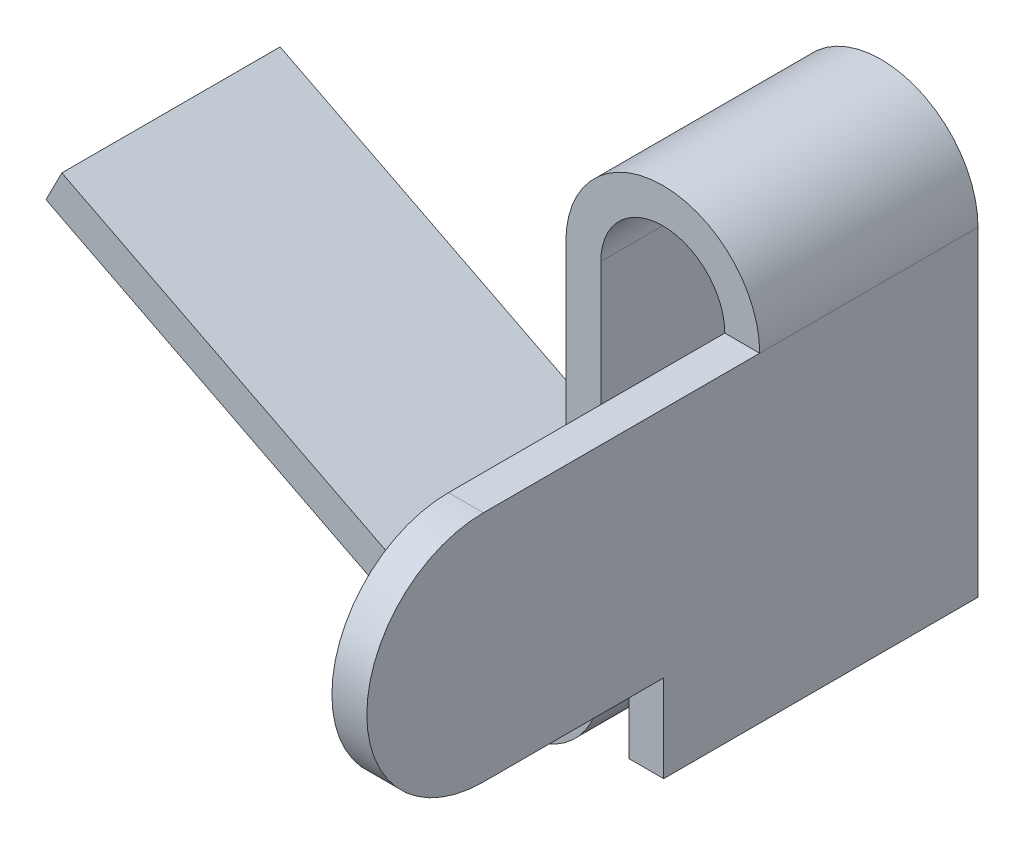
ISO-10303-21;
HEADER;
FILE_DESCRIPTION(('STEP AP214'),'2;1');
FILE_NAME('part.step','',(''),(''),'','','');
FILE_SCHEMA(('AUTOMOTIVE_DESIGN { 1 0 10303 214 1 1 1 1 }'));
ENDSEC;
DATA;
#1=APPLICATION_CONTEXT('core data for automotive mechanical design processes');
#2=APPLICATION_PROTOCOL_DEFINITION('international standard','automotive_design',2000,#1);
#3=PRODUCT_CONTEXT('',#1,'mechanical');
#4=PRODUCT('Part','Part','',(#3));
#5=PRODUCT_RELATED_PRODUCT_CATEGORY('part','',(#4));
#6=PRODUCT_DEFINITION_FORMATION('','',#4);
#7=PRODUCT_DEFINITION_CONTEXT('part definition',#1,'design');
#8=PRODUCT_DEFINITION('design','',#6,#7);
#9=PRODUCT_DEFINITION_SHAPE('','',#8);
#10=(LENGTH_UNIT() NAMED_UNIT(*) SI_UNIT(.MILLI.,.METRE.));
#11=(NAMED_UNIT(*) PLANE_ANGLE_UNIT() SI_UNIT($,.RADIAN.));
#12=(NAMED_UNIT(*) SI_UNIT($,.STERADIAN.) SOLID_ANGLE_UNIT());
#13=UNCERTAINTY_MEASURE_WITH_UNIT(LENGTH_MEASURE(1.E-05),#10,'distance_accuracy_value','');
#14=(GEOMETRIC_REPRESENTATION_CONTEXT(3) GLOBAL_UNCERTAINTY_ASSIGNED_CONTEXT((#13)) GLOBAL_UNIT_ASSIGNED_CONTEXT((#10,
#11,#12)) REPRESENTATION_CONTEXT('',''));
#15=CARTESIAN_POINT('',(0.,0.,0.));
#16=DIRECTION('',(0.,0.,1.));
#17=DIRECTION('',(1.,0.,0.));
#18=AXIS2_PLACEMENT_3D('',#15,#16,#17);
#19=CARTESIAN_POINT('',(0.71,2.335,5.665));
#20=DIRECTION('',(-1.,0.,0.));
#21=DIRECTION('',(0.,0.,1.));
#22=AXIS2_PLACEMENT_3D('',#19,#20,#21);
#23=CYLINDRICAL_SURFACE('',#22,1.335);
#24=DIRECTION('',(-1.,0.,0.));
#25=VECTOR('',#24,1.);
#26=CARTESIAN_POINT('',(0.71,3.67,5.665));
#27=LINE('',#26,#25);
#28=CARTESIAN_POINT('',(0.71,3.67,5.665));
#29=VERTEX_POINT('',#28);
#30=CARTESIAN_POINT('',(1.11,3.67,5.665));
#31=VERTEX_POINT('',#30);
#32=EDGE_CURVE('E262',#29,#31,#27,.F.);
#33=ORIENTED_EDGE('',*,*,#32,.F.);
#34=CARTESIAN_POINT('',(0.71,2.335,5.665));
#35=DIRECTION('',(-1.,0.,0.));
#36=DIRECTION('',(0.,-1.,0.));
#37=AXIS2_PLACEMENT_3D('',#34,#35,#36);
#38=CIRCLE('',#37,1.335);
#39=CARTESIAN_POINT('',(0.71,1.,5.665));
#40=VERTEX_POINT('',#39);
#41=EDGE_CURVE('E44',#40,#29,#38,.T.);
#42=ORIENTED_EDGE('',*,*,#41,.F.);
#43=DIRECTION('',(-1.,0.,0.));
#44=VECTOR('',#43,1.);
#45=CARTESIAN_POINT('',(-7.06552638277556,0.999999999999999,5.665));
#46=LINE('',#45,#44);
#47=CARTESIAN_POINT('',(1.11,1.,5.665));
#48=VERTEX_POINT('',#47);
#49=EDGE_CURVE('E146',#48,#40,#46,.T.);
#50=ORIENTED_EDGE('',*,*,#49,.F.);
#51=CARTESIAN_POINT('',(1.11,2.335,5.665));
#52=DIRECTION('',(-1.,0.,0.));
#53=DIRECTION('',(0.,-1.,0.));
#54=AXIS2_PLACEMENT_3D('',#51,#52,#53);
#55=CIRCLE('',#54,1.335);
#56=EDGE_CURVE('E11',#31,#48,#55,.F.);
#57=ORIENTED_EDGE('',*,*,#56,.F.);
#58=EDGE_LOOP('',(#33,#42,#50,#57));
#59=FACE_BOUND('',#58,.T.);
#60=ADVANCED_FACE('F36',(#59),#23,.T.);
#61=CARTESIAN_POINT('',(0.71,3.67,0.));
#62=DIRECTION('',(0.,0.,-1.));
#63=DIRECTION('',(0.,-1.,0.));
#64=AXIS2_PLACEMENT_3D('',#61,#62,#63);
#65=PLANE('',#64);
#66=DIRECTION('',(0.,-1.,0.));
#67=VECTOR('',#66,1.);
#68=CARTESIAN_POINT('',(0.71,3.67,0.));
#69=LINE('',#68,#67);
#70=CARTESIAN_POINT('',(0.71,3.67,0.));
#71=VERTEX_POINT('',#70);
#72=CARTESIAN_POINT('',(0.71,0.,0.));
#73=VERTEX_POINT('',#72);
#74=EDGE_CURVE('E181',#71,#73,#69,.T.);
#75=ORIENTED_EDGE('',*,*,#74,.F.);
#76=CARTESIAN_POINT('',(0.,3.67,0.));
#77=DIRECTION('',(0.,0.,-1.));
#78=DIRECTION('',(-1.,0.,0.));
#79=AXIS2_PLACEMENT_3D('',#76,#77,#78);
#80=CIRCLE('',#79,0.71);
#81=CARTESIAN_POINT('',(-0.71,3.67,0.));
#82=VERTEX_POINT('',#81);
#83=EDGE_CURVE('E177',#82,#71,#80,.T.);
#84=ORIENTED_EDGE('',*,*,#83,.F.);
#85=DIRECTION('',(0.,1.,0.));
#86=VECTOR('',#85,1.);
#87=CARTESIAN_POINT('',(-0.71,0.,0.));
#88=LINE('',#87,#86);
#89=CARTESIAN_POINT('',(-0.71,-0.5,0.));
#90=VERTEX_POINT('',#89);
#91=EDGE_CURVE('E184',#90,#82,#88,.T.);
#92=ORIENTED_EDGE('',*,*,#91,.F.);
#93=CARTESIAN_POINT('',(-1.71,-0.5,0.));
#94=DIRECTION('',(0.,0.,1.));
#95=DIRECTION('',(-1.,0.,0.));
#96=AXIS2_PLACEMENT_3D('',#93,#94,#95);
#97=CIRCLE('',#96,1.);
#98=CARTESIAN_POINT('',(-2.16399049973955,-1.39100652418837,0.));
#99=VERTEX_POINT('',#98);
#100=EDGE_CURVE('E188',#99,#90,#97,.T.);
#101=ORIENTED_EDGE('',*,*,#100,.F.);
#102=DIRECTION('',(0.891006524188366,-0.453990499739551,0.));
#103=VECTOR('',#102,1.);
#104=CARTESIAN_POINT('',(-2.16399049973955,-1.39100652418837,0.));
#105=LINE('',#104,#103);
#106=CARTESIAN_POINT('',(-7.06452638277556,1.10594122437916,0.));
#107=VERTEX_POINT('',#106);
#108=EDGE_CURVE('E192',#107,#99,#105,.T.);
#109=ORIENTED_EDGE('',*,*,#108,.F.);
#110=DIRECTION('',(-0.453990499739551,-0.891006524188366,0.));
#111=VECTOR('',#110,1.);
#112=CARTESIAN_POINT('',(-7.06452638277556,1.10594122437916,0.));
#113=LINE('',#112,#111);
#114=CARTESIAN_POINT('',(-6.88293018287974,1.46234383405451,0.));
#115=VERTEX_POINT('',#114);
#116=EDGE_CURVE('E260',#115,#107,#113,.T.);
#117=ORIENTED_EDGE('',*,*,#116,.F.);
#118=DIRECTION('',(0.891006524188366,-0.453990499739551,0.));
#119=VECTOR('',#118,1.);
#120=CARTESIAN_POINT('',(-1.98239429984373,-1.03460391451302,0.));
#121=LINE('',#120,#119);
#122=CARTESIAN_POINT('',(-1.98239429984373,-1.03460391451302,0.));
#123=VERTEX_POINT('',#122);
#124=EDGE_CURVE('E209',#115,#123,#121,.T.);
#125=ORIENTED_EDGE('',*,*,#124,.T.);
#126=CARTESIAN_POINT('',(-1.71,-0.5,0.));
#127=DIRECTION('',(0.,0.,1.));
#128=DIRECTION('',(1.,0.,0.));
#129=AXIS2_PLACEMENT_3D('',#126,#127,#128);
#130=CIRCLE('',#129,0.600000000000001);
#131=CARTESIAN_POINT('',(-1.11,-0.5,0.));
#132=VERTEX_POINT('',#131);
#133=EDGE_CURVE('E220',#123,#132,#130,.T.);
#134=ORIENTED_EDGE('',*,*,#133,.T.);
#135=DIRECTION('',(0.,1.,0.));
#136=VECTOR('',#135,1.);
#137=CARTESIAN_POINT('',(-1.11,0.,0.));
#138=LINE('',#137,#136);
#139=CARTESIAN_POINT('',(-1.11,3.67,0.));
#140=VERTEX_POINT('',#139);
#141=EDGE_CURVE('E224',#132,#140,#138,.T.);
#142=ORIENTED_EDGE('',*,*,#141,.T.);
#143=CARTESIAN_POINT('',(0.,3.67,0.));
#144=DIRECTION('',(0.,0.,1.));
#145=DIRECTION('',(1.,0.,0.));
#146=AXIS2_PLACEMENT_3D('',#143,#144,#145);
#147=CIRCLE('',#146,1.11);
#148=CARTESIAN_POINT('',(1.11,3.67,0.));
#149=VERTEX_POINT('',#148);
#150=EDGE_CURVE('E228',#140,#149,#147,.F.);
#151=ORIENTED_EDGE('',*,*,#150,.T.);
#152=DIRECTION('',(0.,-1.,0.));
#153=VECTOR('',#152,1.);
#154=CARTESIAN_POINT('',(1.11,3.67,0.));
#155=LINE('',#154,#153);
#156=CARTESIAN_POINT('',(1.11,0.,0.));
#157=VERTEX_POINT('',#156);
#158=EDGE_CURVE('E232',#149,#157,#155,.T.);
#159=ORIENTED_EDGE('',*,*,#158,.T.);
#160=DIRECTION('',(-1.,0.,0.));
#161=VECTOR('',#160,1.);
#162=CARTESIAN_POINT('',(0.71,0.,0.));
#163=LINE('',#162,#161);
#164=EDGE_CURVE('E258',#157,#73,#163,.T.);
#165=ORIENTED_EDGE('',*,*,#164,.T.);
#166=EDGE_LOOP('',(#75,#84,#92,#101,#109,#117,#125,#134,#142,#151,#159,#165));
#167=FACE_BOUND('',#166,.T.);
#168=ADVANCED_FACE('F315',(#167),#65,.T.);
#169=CARTESIAN_POINT('',(0.71,0.,0.));
#170=DIRECTION('',(0.,-1.,0.));
#171=DIRECTION('',(0.,0.,1.));
#172=AXIS2_PLACEMENT_3D('',#169,#170,#171);
#173=PLANE('',#172);
#174=DIRECTION('',(1.,0.,0.));
#175=VECTOR('',#174,1.);
#176=CARTESIAN_POINT('',(-7.06552638277556,0.,3.6));
#177=LINE('',#176,#175);
#178=CARTESIAN_POINT('',(0.710000000000001,0.,3.6));
#179=VERTEX_POINT('',#178);
#180=CARTESIAN_POINT('',(1.11,0.,3.6));
#181=VERTEX_POINT('',#180);
#182=EDGE_CURVE('E157',#179,#181,#177,.T.);
#183=ORIENTED_EDGE('',*,*,#182,.F.);
#184=DIRECTION('',(0.,0.,1.));
#185=VECTOR('',#184,1.);
#186=CARTESIAN_POINT('',(0.71,0.,0.));
#187=LINE('',#186,#185);
#188=EDGE_CURVE('E163',#73,#179,#187,.T.);
#189=ORIENTED_EDGE('',*,*,#188,.F.);
#190=ORIENTED_EDGE('',*,*,#164,.F.);
#191=DIRECTION('',(0.,0.,1.));
#192=VECTOR('',#191,1.);
#193=CARTESIAN_POINT('',(1.11,0.,0.));
#194=LINE('',#193,#192);
#195=EDGE_CURVE('E243',#157,#181,#194,.T.);
#196=ORIENTED_EDGE('',*,*,#195,.T.);
#197=EDGE_LOOP('',(#183,#189,#190,#196));
#198=FACE_BOUND('',#197,.T.);
#199=ADVANCED_FACE('F314',(#198),#173,.T.);
#200=CARTESIAN_POINT('',(-2.16399049973955,-1.39100652418837,2.5));
#201=DIRECTION('',(0.,0.,-1.));
#202=DIRECTION('',(0.891006524188366,-0.453990499739551,0.));
#203=AXIS2_PLACEMENT_3D('',#200,#201,#202);
#204=PLANE('',#203);
#205=DIRECTION('',(-1.,0.,0.));
#206=VECTOR('',#205,1.);
#207=CARTESIAN_POINT('',(0.71,3.67,2.5));
#208=LINE('',#207,#206);
#209=CARTESIAN_POINT('',(1.11,3.67,2.5));
#210=VERTEX_POINT('',#209);
#211=CARTESIAN_POINT('',(0.71,3.67,2.5));
#212=VERTEX_POINT('',#211);
#213=EDGE_CURVE('E156',#210,#212,#208,.T.);
#214=ORIENTED_EDGE('',*,*,#213,.F.);
#215=CARTESIAN_POINT('',(0.,3.67,2.5));
#216=DIRECTION('',(0.,0.,1.));
#217=DIRECTION('',(1.,0.,0.));
#218=AXIS2_PLACEMENT_3D('',#215,#216,#217);
#219=CIRCLE('',#218,1.11);
#220=CARTESIAN_POINT('',(-1.11,3.67,2.5));
#221=VERTEX_POINT('',#220);
#222=EDGE_CURVE('E229',#221,#210,#219,.F.);
#223=ORIENTED_EDGE('',*,*,#222,.F.);
#224=DIRECTION('',(0.,1.,0.));
#225=VECTOR('',#224,1.);
#226=CARTESIAN_POINT('',(-1.11,0.,2.5));
#227=LINE('',#226,#225);
#228=CARTESIAN_POINT('',(-1.11,-0.5,2.5));
#229=VERTEX_POINT('',#228);
#230=EDGE_CURVE('E225',#229,#221,#227,.T.);
#231=ORIENTED_EDGE('',*,*,#230,.F.);
#232=CARTESIAN_POINT('',(-1.71,-0.5,2.5));
#233=DIRECTION('',(0.,0.,1.));
#234=DIRECTION('',(1.,0.,0.));
#235=AXIS2_PLACEMENT_3D('',#232,#233,#234);
#236=CIRCLE('',#235,0.600000000000001);
#237=CARTESIAN_POINT('',(-1.98239429984373,-1.03460391451302,2.5));
#238=VERTEX_POINT('',#237);
#239=EDGE_CURVE('E221',#238,#229,#236,.T.);
#240=ORIENTED_EDGE('',*,*,#239,.F.);
#241=DIRECTION('',(0.891006524188366,-0.453990499739551,0.));
#242=VECTOR('',#241,1.);
#243=CARTESIAN_POINT('',(-1.98239429984373,-1.03460391451302,2.5));
#244=LINE('',#243,#242);
#245=CARTESIAN_POINT('',(-6.88293018287974,1.46234383405451,2.5));
#246=VERTEX_POINT('',#245);
#247=EDGE_CURVE('E233',#246,#238,#244,.T.);
#248=ORIENTED_EDGE('',*,*,#247,.F.);
#249=DIRECTION('',(-0.453990499739551,-0.891006524188366,0.));
#250=VECTOR('',#249,1.);
#251=CARTESIAN_POINT('',(-7.06452638277556,1.10594122437916,2.5));
#252=LINE('',#251,#250);
#253=CARTESIAN_POINT('',(-7.06452638277556,1.10594122437916,2.5));
#254=VERTEX_POINT('',#253);
#255=EDGE_CURVE('E195',#246,#254,#252,.T.);
#256=ORIENTED_EDGE('',*,*,#255,.T.);
#257=DIRECTION('',(0.891006524188366,-0.453990499739551,0.));
#258=VECTOR('',#257,1.);
#259=CARTESIAN_POINT('',(-2.16399049973955,-1.39100652418837,2.5));
#260=LINE('',#259,#258);
#261=CARTESIAN_POINT('',(-2.16399049973955,-1.39100652418837,2.5));
#262=VERTEX_POINT('',#261);
#263=EDGE_CURVE('E190',#254,#262,#260,.T.);
#264=ORIENTED_EDGE('',*,*,#263,.T.);
#265=CARTESIAN_POINT('',(-1.71,-0.5,2.5));
#266=DIRECTION('',(0.,0.,1.));
#267=DIRECTION('',(-1.,0.,0.));
#268=AXIS2_PLACEMENT_3D('',#265,#266,#267);
#269=CIRCLE('',#268,1.);
#270=CARTESIAN_POINT('',(-0.71,-0.5,2.5));
#271=VERTEX_POINT('',#270);
#272=EDGE_CURVE('E186',#262,#271,#269,.T.);
#273=ORIENTED_EDGE('',*,*,#272,.T.);
#274=DIRECTION('',(0.,1.,0.));
#275=VECTOR('',#274,1.);
#276=CARTESIAN_POINT('',(-0.71,0.,2.5));
#277=LINE('',#276,#275);
#278=CARTESIAN_POINT('',(-0.71,3.67,2.5));
#279=VERTEX_POINT('',#278);
#280=EDGE_CURVE('E179',#271,#279,#277,.T.);
#281=ORIENTED_EDGE('',*,*,#280,.T.);
#282=CARTESIAN_POINT('',(0.,3.67,2.5));
#283=DIRECTION('',(0.,0.,-1.));
#284=DIRECTION('',(-1.,0.,0.));
#285=AXIS2_PLACEMENT_3D('',#282,#283,#284);
#286=CIRCLE('',#285,0.71);
#287=EDGE_CURVE('E199',#279,#212,#286,.T.);
#288=ORIENTED_EDGE('',*,*,#287,.T.);
#289=EDGE_LOOP('',(#214,#223,#231,#240,#248,#256,#264,#273,#281,#288));
#290=FACE_BOUND('',#289,.T.);
#291=ADVANCED_FACE('F273',(#290),#204,.F.);
#292=CARTESIAN_POINT('',(-7.06452638277556,1.10594122437916,0.));
#293=DIRECTION('',(0.891006524188366,-0.453990499739551,0.));
#294=DIRECTION('',(0.,0.,1.));
#295=AXIS2_PLACEMENT_3D('',#292,#293,#294);
#296=PLANE('',#295);
#297=DIRECTION('',(0.,0.,1.));
#298=VECTOR('',#297,1.);
#299=CARTESIAN_POINT('',(-6.88293018287974,1.46234383405451,0.));
#300=LINE('',#299,#298);
#301=EDGE_CURVE('E236',#115,#246,#300,.T.);
#302=ORIENTED_EDGE('',*,*,#301,.F.);
#303=ORIENTED_EDGE('',*,*,#116,.T.);
#304=DIRECTION('',(0.,0.,1.));
#305=VECTOR('',#304,1.);
#306=CARTESIAN_POINT('',(-7.06452638277556,1.10594122437916,0.));
#307=LINE('',#306,#305);
#308=EDGE_CURVE('E196',#107,#254,#307,.T.);
#309=ORIENTED_EDGE('',*,*,#308,.T.);
#310=ORIENTED_EDGE('',*,*,#255,.F.);
#311=EDGE_LOOP('',(#302,#303,#309,#310));
#312=FACE_BOUND('',#311,.T.);
#313=ADVANCED_FACE('F294',(#312),#296,.F.);
#314=CARTESIAN_POINT('',(-2.16399049973955,-1.39100652418837,0.));
#315=DIRECTION('',(-0.453990499739551,-0.891006524188366,0.));
#316=DIRECTION('',(0.891006524188366,-0.453990499739551,0.));
#317=AXIS2_PLACEMENT_3D('',#314,#315,#316);
#318=PLANE('',#317);
#319=ORIENTED_EDGE('',*,*,#263,.F.);
#320=ORIENTED_EDGE('',*,*,#308,.F.);
#321=ORIENTED_EDGE('',*,*,#108,.T.);
#322=DIRECTION('',(0.,0.,1.));
#323=VECTOR('',#322,1.);
#324=CARTESIAN_POINT('',(-2.16399049973955,-1.39100652418837,0.));
#325=LINE('',#324,#323);
#326=EDGE_CURVE('E191',#99,#262,#325,.T.);
#327=ORIENTED_EDGE('',*,*,#326,.T.);
#328=EDGE_LOOP('',(#319,#320,#321,#327));
#329=FACE_BOUND('',#328,.T.);
#330=ADVANCED_FACE('F298',(#329),#318,.T.);
#331=CARTESIAN_POINT('',(-1.71,-0.5,0.));
#332=DIRECTION('',(0.,0.,1.));
#333=DIRECTION('',(1.,0.,0.));
#334=AXIS2_PLACEMENT_3D('',#331,#332,#333);
#335=CYLINDRICAL_SURFACE('',#334,1.);
#336=ORIENTED_EDGE('',*,*,#272,.F.);
#337=ORIENTED_EDGE('',*,*,#326,.F.);
#338=ORIENTED_EDGE('',*,*,#100,.T.);
#339=DIRECTION('',(0.,0.,1.));
#340=VECTOR('',#339,1.);
#341=CARTESIAN_POINT('',(-0.71,-0.5,0.));
#342=LINE('',#341,#340);
#343=EDGE_CURVE('E187',#90,#271,#342,.T.);
#344=ORIENTED_EDGE('',*,*,#343,.T.);
#345=EDGE_LOOP('',(#336,#337,#338,#344));
#346=FACE_BOUND('',#345,.T.);
#347=ADVANCED_FACE('F302',(#346),#335,.T.);
#348=CARTESIAN_POINT('',(-0.71,0.,0.));
#349=DIRECTION('',(1.,0.,0.));
#350=DIRECTION('',(0.,0.,-1.));
#351=AXIS2_PLACEMENT_3D('',#348,#349,#350);
#352=PLANE('',#351);
#353=ORIENTED_EDGE('',*,*,#280,.F.);
#354=ORIENTED_EDGE('',*,*,#343,.F.);
#355=ORIENTED_EDGE('',*,*,#91,.T.);
#356=DIRECTION('',(0.,0.,1.));
#357=VECTOR('',#356,1.);
#358=CARTESIAN_POINT('',(-0.71,3.67,0.));
#359=LINE('',#358,#357);
#360=EDGE_CURVE('E180',#82,#279,#359,.T.);
#361=ORIENTED_EDGE('',*,*,#360,.T.);
#362=EDGE_LOOP('',(#353,#354,#355,#361));
#363=FACE_BOUND('',#362,.T.);
#364=ADVANCED_FACE('F307',(#363),#352,.T.);
#365=CARTESIAN_POINT('',(0.,3.67,0.));
#366=DIRECTION('',(0.,0.,1.));
#367=DIRECTION('',(1.,0.,0.));
#368=AXIS2_PLACEMENT_3D('',#365,#366,#367);
#369=CYLINDRICAL_SURFACE('',#368,0.71);
#370=ORIENTED_EDGE('',*,*,#287,.F.);
#371=ORIENTED_EDGE('',*,*,#360,.F.);
#372=ORIENTED_EDGE('',*,*,#83,.T.);
#373=DIRECTION('',(0.,0.,1.));
#374=VECTOR('',#373,1.);
#375=CARTESIAN_POINT('',(0.71,3.67,0.));
#376=LINE('',#375,#374);
#377=EDGE_CURVE('E183',#71,#212,#376,.T.);
#378=ORIENTED_EDGE('',*,*,#377,.T.);
#379=EDGE_LOOP('',(#370,#371,#372,#378));
#380=FACE_BOUND('',#379,.T.);
#381=ADVANCED_FACE('F310',(#380),#369,.F.);
#382=CARTESIAN_POINT('',(0.71,3.67,0.));
#383=DIRECTION('',(-1.,0.,0.));
#384=DIRECTION('',(0.,-1.,0.));
#385=AXIS2_PLACEMENT_3D('',#382,#383,#384);
#386=PLANE('',#385);
#387=DIRECTION('',(0.,0.,1.));
#388=VECTOR('',#387,1.);
#389=CARTESIAN_POINT('',(0.71,1.,7.));
#390=LINE('',#389,#388);
#391=CARTESIAN_POINT('',(0.71,1.,3.6));
#392=VERTEX_POINT('',#391);
#393=EDGE_CURVE('E140',#392,#40,#390,.T.);
#394=ORIENTED_EDGE('',*,*,#393,.T.);
#395=ORIENTED_EDGE('',*,*,#41,.T.);
#396=DIRECTION('',(0.,0.,-1.));
#397=VECTOR('',#396,1.);
#398=CARTESIAN_POINT('',(0.71,3.67,7.));
#399=LINE('',#398,#397);
#400=EDGE_CURVE('E172',#29,#212,#399,.T.);
#401=ORIENTED_EDGE('',*,*,#400,.T.);
#402=ORIENTED_EDGE('',*,*,#377,.F.);
#403=ORIENTED_EDGE('',*,*,#74,.T.);
#404=ORIENTED_EDGE('',*,*,#188,.T.);
#405=DIRECTION('',(0.,1.,0.));
#406=VECTOR('',#405,1.);
#407=CARTESIAN_POINT('',(0.710000000000001,0.,3.6));
#408=LINE('',#407,#406);
#409=EDGE_CURVE('E150',#179,#392,#408,.T.);
#410=ORIENTED_EDGE('',*,*,#409,.T.);
#411=EDGE_LOOP('',(#394,#395,#401,#402,#403,#404,#410));
#412=FACE_BOUND('',#411,.T.);
#413=ADVANCED_FACE('F160',(#412),#386,.T.);
#414=CARTESIAN_POINT('',(-1.98239429984373,-1.03460391451302,0.));
#415=DIRECTION('',(-0.453990499739551,-0.891006524188366,0.));
#416=DIRECTION('',(0.891006524188366,-0.453990499739551,0.));
#417=AXIS2_PLACEMENT_3D('',#414,#415,#416);
#418=PLANE('',#417);
#419=ORIENTED_EDGE('',*,*,#247,.T.);
#420=DIRECTION('',(0.,0.,1.));
#421=VECTOR('',#420,1.);
#422=CARTESIAN_POINT('',(-1.98239429984373,-1.03460391451302,0.));
#423=LINE('',#422,#421);
#424=EDGE_CURVE('E218',#123,#238,#423,.T.);
#425=ORIENTED_EDGE('',*,*,#424,.F.);
#426=ORIENTED_EDGE('',*,*,#124,.F.);
#427=ORIENTED_EDGE('',*,*,#301,.T.);
#428=EDGE_LOOP('',(#419,#425,#426,#427));
#429=FACE_BOUND('',#428,.T.);
#430=ADVANCED_FACE('F291',(#429),#418,.F.);
#431=CARTESIAN_POINT('',(-1.71,-0.5,0.));
#432=DIRECTION('',(0.,0.,1.));
#433=DIRECTION('',(1.,0.,0.));
#434=AXIS2_PLACEMENT_3D('',#431,#432,#433);
#435=CYLINDRICAL_SURFACE('',#434,0.600000000000001);
#436=ORIENTED_EDGE('',*,*,#239,.T.);
#437=DIRECTION('',(0.,0.,1.));
#438=VECTOR('',#437,1.);
#439=CARTESIAN_POINT('',(-1.11,-0.5,0.));
#440=LINE('',#439,#438);
#441=EDGE_CURVE('E222',#132,#229,#440,.T.);
#442=ORIENTED_EDGE('',*,*,#441,.F.);
#443=ORIENTED_EDGE('',*,*,#133,.F.);
#444=ORIENTED_EDGE('',*,*,#424,.T.);
#445=EDGE_LOOP('',(#436,#442,#443,#444));
#446=FACE_BOUND('',#445,.T.);
#447=ADVANCED_FACE('F287',(#446),#435,.F.);
#448=CARTESIAN_POINT('',(-1.11,0.,0.));
#449=DIRECTION('',(1.,0.,0.));
#450=DIRECTION('',(0.,0.,-1.));
#451=AXIS2_PLACEMENT_3D('',#448,#449,#450);
#452=PLANE('',#451);
#453=ORIENTED_EDGE('',*,*,#230,.T.);
#454=DIRECTION('',(0.,0.,-1.));
#455=VECTOR('',#454,1.);
#456=CARTESIAN_POINT('',(-1.11,3.67,0.));
#457=LINE('',#456,#455);
#458=EDGE_CURVE('E226',#140,#221,#457,.F.);
#459=ORIENTED_EDGE('',*,*,#458,.F.);
#460=ORIENTED_EDGE('',*,*,#141,.F.);
#461=ORIENTED_EDGE('',*,*,#441,.T.);
#462=EDGE_LOOP('',(#453,#459,#460,#461));
#463=FACE_BOUND('',#462,.T.);
#464=ADVANCED_FACE('F283',(#463),#452,.F.);
#465=CARTESIAN_POINT('',(0.,3.67,0.));
#466=DIRECTION('',(0.,0.,1.));
#467=DIRECTION('',(1.,0.,0.));
#468=AXIS2_PLACEMENT_3D('',#465,#466,#467);
#469=CYLINDRICAL_SURFACE('',#468,1.11);
#470=ORIENTED_EDGE('',*,*,#222,.T.);
#471=DIRECTION('',(0.,0.,1.));
#472=VECTOR('',#471,1.);
#473=CARTESIAN_POINT('',(1.11,3.67,0.));
#474=LINE('',#473,#472);
#475=EDGE_CURVE('E176',#149,#210,#474,.T.);
#476=ORIENTED_EDGE('',*,*,#475,.F.);
#477=ORIENTED_EDGE('',*,*,#150,.F.);
#478=ORIENTED_EDGE('',*,*,#458,.T.);
#479=EDGE_LOOP('',(#470,#476,#477,#478));
#480=FACE_BOUND('',#479,.T.);
#481=ADVANCED_FACE('F280',(#480),#469,.T.);
#482=CARTESIAN_POINT('',(1.11,3.67,0.));
#483=DIRECTION('',(-1.,0.,0.));
#484=DIRECTION('',(0.,-1.,0.));
#485=AXIS2_PLACEMENT_3D('',#482,#483,#484);
#486=PLANE('',#485);
#487=DIRECTION('',(0.,0.,-1.));
#488=VECTOR('',#487,1.);
#489=CARTESIAN_POINT('',(1.11,3.67,7.));
#490=LINE('',#489,#488);
#491=EDGE_CURVE('E174',#31,#210,#490,.T.);
#492=ORIENTED_EDGE('',*,*,#491,.F.);
#493=ORIENTED_EDGE('',*,*,#56,.T.);
#494=DIRECTION('',(0.,0.,1.));
#495=VECTOR('',#494,1.);
#496=CARTESIAN_POINT('',(1.11,1.,7.));
#497=LINE('',#496,#495);
#498=CARTESIAN_POINT('',(1.11,1.,3.6));
#499=VERTEX_POINT('',#498);
#500=EDGE_CURVE('E167',#499,#48,#497,.T.);
#501=ORIENTED_EDGE('',*,*,#500,.F.);
#502=DIRECTION('',(0.,1.,0.));
#503=VECTOR('',#502,1.);
#504=CARTESIAN_POINT('',(1.11,0.,3.6));
#505=LINE('',#504,#503);
#506=EDGE_CURVE('E149',#181,#499,#505,.T.);
#507=ORIENTED_EDGE('',*,*,#506,.F.);
#508=ORIENTED_EDGE('',*,*,#195,.F.);
#509=ORIENTED_EDGE('',*,*,#158,.F.);
#510=ORIENTED_EDGE('',*,*,#475,.T.);
#511=EDGE_LOOP('',(#492,#493,#501,#507,#508,#509,#510));
#512=FACE_BOUND('',#511,.T.);
#513=ADVANCED_FACE('F276',(#512),#486,.F.);
#514=CARTESIAN_POINT('',(0.71,3.67,7.));
#515=DIRECTION('',(0.,-1.,0.));
#516=DIRECTION('',(0.,0.,-1.));
#517=AXIS2_PLACEMENT_3D('',#514,#515,#516);
#518=PLANE('',#517);
#519=ORIENTED_EDGE('',*,*,#400,.F.);
#520=ORIENTED_EDGE('',*,*,#32,.T.);
#521=ORIENTED_EDGE('',*,*,#491,.T.);
#522=ORIENTED_EDGE('',*,*,#213,.T.);
#523=EDGE_LOOP('',(#519,#520,#521,#522));
#524=FACE_BOUND('',#523,.T.);
#525=ADVANCED_FACE('F269',(#524),#518,.F.);
#526=CARTESIAN_POINT('',(-7.06552638277556,0.999999999999999,7.));
#527=DIRECTION('',(0.,1.,0.));
#528=DIRECTION('',(-1.,0.,0.));
#529=AXIS2_PLACEMENT_3D('',#526,#527,#528);
#530=PLANE('',#529);
#531=ORIENTED_EDGE('',*,*,#500,.T.);
#532=ORIENTED_EDGE('',*,*,#49,.T.);
#533=ORIENTED_EDGE('',*,*,#393,.F.);
#534=DIRECTION('',(1.,0.,0.));
#535=VECTOR('',#534,1.);
#536=CARTESIAN_POINT('',(-7.06552638277556,0.999999999999999,3.6));
#537=LINE('',#536,#535);
#538=EDGE_CURVE('E144',#392,#499,#537,.T.);
#539=ORIENTED_EDGE('',*,*,#538,.T.);
#540=EDGE_LOOP('',(#531,#532,#533,#539));
#541=FACE_BOUND('',#540,.T.);
#542=ADVANCED_FACE('F143',(#541),#530,.F.);
#543=CARTESIAN_POINT('',(-7.06552638277556,0.,3.6));
#544=DIRECTION('',(0.,0.,-1.));
#545=DIRECTION('',(-1.,0.,0.));
#546=AXIS2_PLACEMENT_3D('',#543,#544,#545);
#547=PLANE('',#546);
#548=ORIENTED_EDGE('',*,*,#182,.T.);
#549=ORIENTED_EDGE('',*,*,#506,.T.);
#550=ORIENTED_EDGE('',*,*,#538,.F.);
#551=ORIENTED_EDGE('',*,*,#409,.F.);
#552=EDGE_LOOP('',(#548,#549,#550,#551));
#553=FACE_BOUND('',#552,.T.);
#554=ADVANCED_FACE('F153',(#553),#547,.F.);
#555=CLOSED_SHELL('',(#60,#168,#199,#291,#313,#330,#347,#364,#381,#413,#430,#447,#464,#481,#513,
#525,#542,#554));
#556=MANIFOLD_SOLID_BREP('B2',#555);
#557=ADVANCED_BREP_SHAPE_REPRESENTATION('',(#18,#556),#14);
#558=SHAPE_DEFINITION_REPRESENTATION(#9,#557);
ENDSEC;
END-ISO-10303-21;
